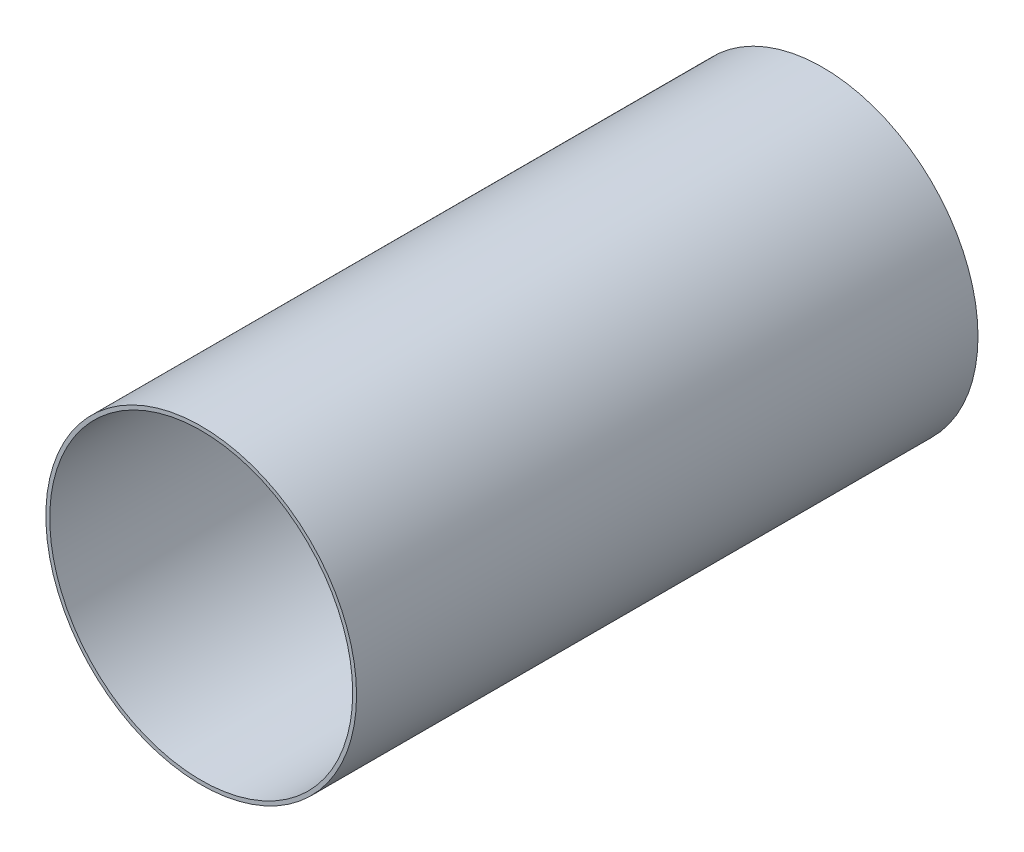
ISO-10303-21;
HEADER;
FILE_DESCRIPTION(('STEP AP214'),'2;1');
FILE_NAME('part.step','',(''),(''),'','','');
FILE_SCHEMA(('AUTOMOTIVE_DESIGN { 1 0 10303 214 1 1 1 1 }'));
ENDSEC;
DATA;
#1=APPLICATION_CONTEXT('core data for automotive mechanical design processes');
#2=APPLICATION_PROTOCOL_DEFINITION('international standard','automotive_design',2000,#1);
#3=PRODUCT_CONTEXT('',#1,'mechanical');
#4=PRODUCT('Part','Part','',(#3));
#5=PRODUCT_RELATED_PRODUCT_CATEGORY('part','',(#4));
#6=PRODUCT_DEFINITION_FORMATION('','',#4);
#7=PRODUCT_DEFINITION_CONTEXT('part definition',#1,'design');
#8=PRODUCT_DEFINITION('design','',#6,#7);
#9=PRODUCT_DEFINITION_SHAPE('','',#8);
#10=(LENGTH_UNIT() NAMED_UNIT(*) SI_UNIT(.MILLI.,.METRE.));
#11=(NAMED_UNIT(*) PLANE_ANGLE_UNIT() SI_UNIT($,.RADIAN.));
#12=(NAMED_UNIT(*) SI_UNIT($,.STERADIAN.) SOLID_ANGLE_UNIT());
#13=UNCERTAINTY_MEASURE_WITH_UNIT(LENGTH_MEASURE(1.E-05),#10,'distance_accuracy_value','');
#14=(GEOMETRIC_REPRESENTATION_CONTEXT(3) GLOBAL_UNCERTAINTY_ASSIGNED_CONTEXT((#13)) GLOBAL_UNIT_ASSIGNED_CONTEXT((#10,
#11,#12)) REPRESENTATION_CONTEXT('',''));
#15=CARTESIAN_POINT('',(0.,0.,0.));
#16=DIRECTION('',(0.,0.,1.));
#17=DIRECTION('',(1.,0.,0.));
#18=AXIS2_PLACEMENT_3D('',#15,#16,#17);
#19=CARTESIAN_POINT('',(0.,0.,160.));
#20=DIRECTION('',(0.,0.,1.));
#21=DIRECTION('',(1.,0.,0.));
#22=AXIS2_PLACEMENT_3D('',#19,#20,#21);
#23=PLANE('',#22);
#24=CARTESIAN_POINT('',(0.,0.,160.));
#25=DIRECTION('',(0.,0.,1.));
#26=DIRECTION('',(1.,0.,0.));
#27=AXIS2_PLACEMENT_3D('',#24,#25,#26);
#28=CIRCLE('',#27,40.);
#29=CARTESIAN_POINT('',(40.,0.,160.));
#30=VERTEX_POINT('',#29);
#31=EDGE_CURVE('E10',#30,#30,#28,.T.);
#32=ORIENTED_EDGE('',*,*,#31,.T.);
#33=EDGE_LOOP('',(#32));
#34=FACE_BOUND('',#33,.T.);
#35=CARTESIAN_POINT('',(0.,0.,160.));
#36=DIRECTION('',(0.,0.,1.));
#37=DIRECTION('',(1.,0.,0.));
#38=AXIS2_PLACEMENT_3D('',#35,#36,#37);
#39=CIRCLE('',#38,39.);
#40=CARTESIAN_POINT('',(39.,0.,160.));
#41=VERTEX_POINT('',#40);
#42=EDGE_CURVE('E52',#41,#41,#39,.T.);
#43=ORIENTED_EDGE('',*,*,#42,.F.);
#44=EDGE_LOOP('',(#43));
#45=FACE_BOUND('',#44,.T.);
#46=ADVANCED_FACE('F39',(#34,#45),#23,.T.);
#47=CARTESIAN_POINT('',(0.,0.,0.));
#48=DIRECTION('',(0.,0.,1.));
#49=DIRECTION('',(1.,0.,0.));
#50=AXIS2_PLACEMENT_3D('',#47,#48,#49);
#51=PLANE('',#50);
#52=CARTESIAN_POINT('',(0.,0.,0.));
#53=DIRECTION('',(0.,0.,1.));
#54=DIRECTION('',(1.,0.,0.));
#55=AXIS2_PLACEMENT_3D('',#52,#53,#54);
#56=CIRCLE('',#55,40.);
#57=CARTESIAN_POINT('',(40.,0.,0.));
#58=VERTEX_POINT('',#57);
#59=EDGE_CURVE('E43',#58,#58,#56,.T.);
#60=ORIENTED_EDGE('',*,*,#59,.F.);
#61=EDGE_LOOP('',(#60));
#62=FACE_BOUND('',#61,.T.);
#63=CARTESIAN_POINT('',(0.,0.,0.));
#64=DIRECTION('',(0.,0.,1.));
#65=DIRECTION('',(1.,0.,0.));
#66=AXIS2_PLACEMENT_3D('',#63,#64,#65);
#67=CIRCLE('',#66,39.);
#68=CARTESIAN_POINT('',(39.,0.,0.));
#69=VERTEX_POINT('',#68);
#70=EDGE_CURVE('E54',#69,#69,#67,.T.);
#71=ORIENTED_EDGE('',*,*,#70,.T.);
#72=EDGE_LOOP('',(#71));
#73=FACE_BOUND('',#72,.T.);
#74=ADVANCED_FACE('F66',(#62,#73),#51,.F.);
#75=CARTESIAN_POINT('',(0.,0.,160.));
#76=DIRECTION('',(0.,0.,-1.));
#77=DIRECTION('',(-1.,0.,0.));
#78=AXIS2_PLACEMENT_3D('',#75,#76,#77);
#79=CYLINDRICAL_SURFACE('',#78,40.);
#80=ORIENTED_EDGE('',*,*,#31,.F.);
#81=EDGE_LOOP('',(#80));
#82=FACE_BOUND('',#81,.T.);
#83=ORIENTED_EDGE('',*,*,#59,.T.);
#84=EDGE_LOOP('',(#83));
#85=FACE_BOUND('',#84,.T.);
#86=ADVANCED_FACE('F41',(#82,#85),#79,.T.);
#87=CARTESIAN_POINT('',(0.,0.,160.));
#88=DIRECTION('',(0.,0.,-1.));
#89=DIRECTION('',(-1.,0.,0.));
#90=AXIS2_PLACEMENT_3D('',#87,#88,#89);
#91=CYLINDRICAL_SURFACE('',#90,39.);
#92=ORIENTED_EDGE('',*,*,#42,.T.);
#93=EDGE_LOOP('',(#92));
#94=FACE_BOUND('',#93,.T.);
#95=ORIENTED_EDGE('',*,*,#70,.F.);
#96=EDGE_LOOP('',(#95));
#97=FACE_BOUND('',#96,.T.);
#98=ADVANCED_FACE('F62',(#94,#97),#91,.F.);
#99=CLOSED_SHELL('',(#46,#74,#86,#98));
#100=MANIFOLD_SOLID_BREP('B2',#99);
#101=ADVANCED_BREP_SHAPE_REPRESENTATION('',(#18,#100),#14);
#102=SHAPE_DEFINITION_REPRESENTATION(#9,#101);
ENDSEC;
END-ISO-10303-21;
